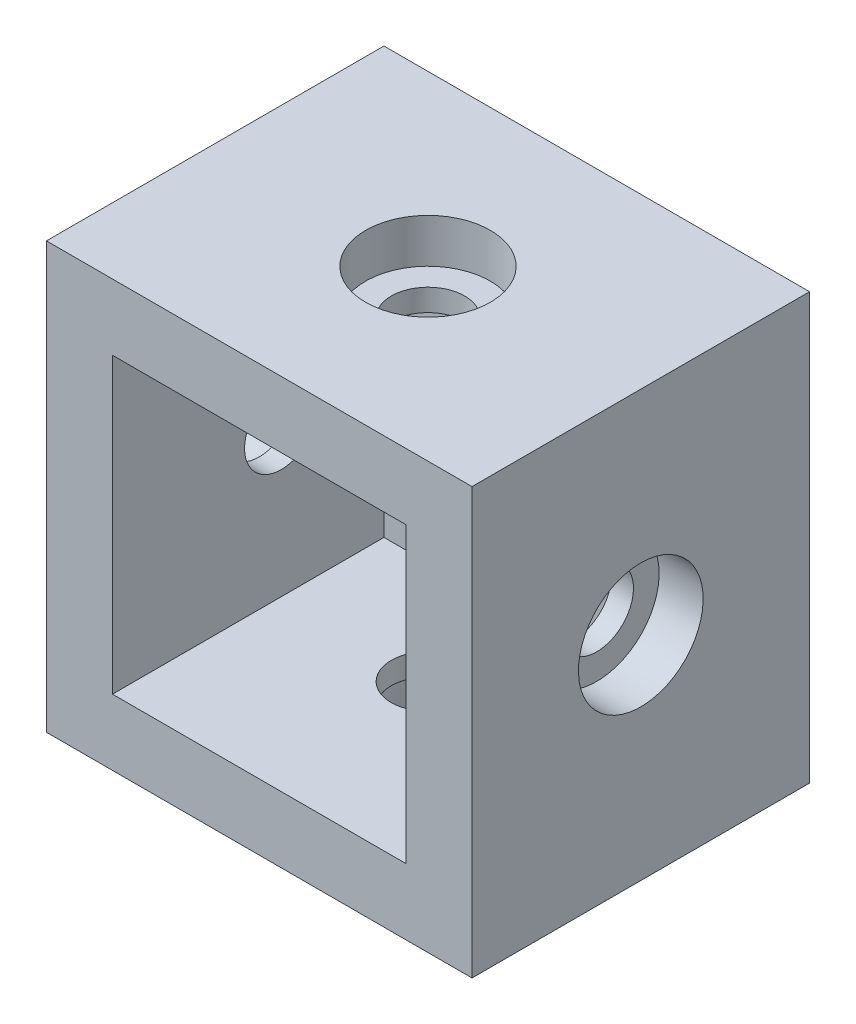
ISO-10303-21;
HEADER;
FILE_DESCRIPTION(('STEP AP214'),'2;1');
FILE_NAME('part.step','',(''),(''),'','','');
FILE_SCHEMA(('AUTOMOTIVE_DESIGN { 1 0 10303 214 1 1 1 1 }'));
ENDSEC;
DATA;
#1=APPLICATION_CONTEXT('core data for automotive mechanical design processes');
#2=APPLICATION_PROTOCOL_DEFINITION('international standard','automotive_design',2000,#1);
#3=PRODUCT_CONTEXT('',#1,'mechanical');
#4=PRODUCT('Part','Part','',(#3));
#5=PRODUCT_RELATED_PRODUCT_CATEGORY('part','',(#4));
#6=PRODUCT_DEFINITION_FORMATION('','',#4);
#7=PRODUCT_DEFINITION_CONTEXT('part definition',#1,'design');
#8=PRODUCT_DEFINITION('design','',#6,#7);
#9=PRODUCT_DEFINITION_SHAPE('','',#8);
#10=(LENGTH_UNIT() NAMED_UNIT(*) SI_UNIT(.MILLI.,.METRE.));
#11=(NAMED_UNIT(*) PLANE_ANGLE_UNIT() SI_UNIT($,.RADIAN.));
#12=(NAMED_UNIT(*) SI_UNIT($,.STERADIAN.) SOLID_ANGLE_UNIT());
#13=UNCERTAINTY_MEASURE_WITH_UNIT(LENGTH_MEASURE(1.E-05),#10,'distance_accuracy_value','');
#14=(GEOMETRIC_REPRESENTATION_CONTEXT(3) GLOBAL_UNCERTAINTY_ASSIGNED_CONTEXT((#13)) GLOBAL_UNIT_ASSIGNED_CONTEXT((#10,
#11,#12)) REPRESENTATION_CONTEXT('',''));
#15=CARTESIAN_POINT('',(0.,0.,0.));
#16=DIRECTION('',(0.,0.,1.));
#17=DIRECTION('',(1.,0.,0.));
#18=AXIS2_PLACEMENT_3D('',#15,#16,#17);
#19=CARTESIAN_POINT('',(-11.6376722482942,12.0163613072181,23.));
#20=DIRECTION('',(1.,0.,0.));
#21=DIRECTION('',(0.,1.,0.));
#22=AXIS2_PLACEMENT_3D('',#19,#20,#21);
#23=PLANE('',#22);
#24=CARTESIAN_POINT('',(-11.6376722482942,-2.48363869278192,11.5));
#25=DIRECTION('',(-1.,0.,0.));
#26=DIRECTION('',(0.,-1.,0.));
#27=AXIS2_PLACEMENT_3D('',#24,#25,#26);
#28=CIRCLE('',#27,4.25);
#29=CARTESIAN_POINT('',(-11.6376722482942,-6.73363869278192,11.5));
#30=VERTEX_POINT('',#29);
#31=EDGE_CURVE('E192',#30,#30,#28,.T.);
#32=ORIENTED_EDGE('',*,*,#31,.F.);
#33=EDGE_LOOP('',(#32));
#34=FACE_BOUND('',#33,.T.);
#35=DIRECTION('',(0.,-1.,0.));
#36=VECTOR('',#35,1.);
#37=CARTESIAN_POINT('',(-11.6376722482942,12.0163613072181,0.));
#38=LINE('',#37,#36);
#39=CARTESIAN_POINT('',(-11.6376722482942,12.0163613072181,0.));
#40=VERTEX_POINT('',#39);
#41=CARTESIAN_POINT('',(-11.6376722482942,-16.9836386927819,0.));
#42=VERTEX_POINT('',#41);
#43=EDGE_CURVE('E155',#40,#42,#38,.T.);
#44=ORIENTED_EDGE('',*,*,#43,.T.);
#45=DIRECTION('',(0.,0.,-1.));
#46=VECTOR('',#45,1.);
#47=CARTESIAN_POINT('',(-11.6376722482942,-16.9836386927819,23.));
#48=LINE('',#47,#46);
#49=CARTESIAN_POINT('',(-11.6376722482942,-16.9836386927819,23.));
#50=VERTEX_POINT('',#49);
#51=EDGE_CURVE('E11',#50,#42,#48,.T.);
#52=ORIENTED_EDGE('',*,*,#51,.F.);
#53=DIRECTION('',(0.,-1.,0.));
#54=VECTOR('',#53,1.);
#55=CARTESIAN_POINT('',(-11.6376722482942,12.0163613072181,23.));
#56=LINE('',#55,#54);
#57=CARTESIAN_POINT('',(-11.6376722482942,12.0163613072181,23.));
#58=VERTEX_POINT('',#57);
#59=EDGE_CURVE('E148',#58,#50,#56,.T.);
#60=ORIENTED_EDGE('',*,*,#59,.F.);
#61=DIRECTION('',(0.,0.,-1.));
#62=VECTOR('',#61,1.);
#63=CARTESIAN_POINT('',(-11.6376722482942,12.0163613072181,23.));
#64=LINE('',#63,#62);
#65=EDGE_CURVE('E154',#58,#40,#64,.T.);
#66=ORIENTED_EDGE('',*,*,#65,.T.);
#67=EDGE_LOOP('',(#44,#52,#60,#66));
#68=FACE_BOUND('',#67,.T.);
#69=ADVANCED_FACE('F39',(#34,#68),#23,.F.);
#70=CARTESIAN_POINT('',(-11.6376722482942,-16.9836386927819,23.));
#71=DIRECTION('',(0.,1.,0.));
#72=DIRECTION('',(0.,0.,1.));
#73=AXIS2_PLACEMENT_3D('',#70,#71,#72);
#74=PLANE('',#73);
#75=CARTESIAN_POINT('',(2.86232775170583,-16.9836386927819,11.5));
#76=DIRECTION('',(0.,-1.,0.));
#77=DIRECTION('',(0.,0.,-1.));
#78=AXIS2_PLACEMENT_3D('',#75,#76,#77);
#79=CIRCLE('',#78,4.25);
#80=CARTESIAN_POINT('',(2.86232775170583,-16.9836386927819,7.25));
#81=VERTEX_POINT('',#80);
#82=EDGE_CURVE('E208',#81,#81,#79,.T.);
#83=ORIENTED_EDGE('',*,*,#82,.F.);
#84=EDGE_LOOP('',(#83));
#85=FACE_BOUND('',#84,.T.);
#86=DIRECTION('',(1.,0.,0.));
#87=VECTOR('',#86,1.);
#88=CARTESIAN_POINT('',(-11.6376722482942,-16.9836386927819,0.));
#89=LINE('',#88,#87);
#90=CARTESIAN_POINT('',(17.3623277517058,-16.9836386927819,0.));
#91=VERTEX_POINT('',#90);
#92=EDGE_CURVE('E158',#42,#91,#89,.T.);
#93=ORIENTED_EDGE('',*,*,#92,.T.);
#94=DIRECTION('',(0.,0.,-1.));
#95=VECTOR('',#94,1.);
#96=CARTESIAN_POINT('',(17.3623277517058,-16.9836386927819,23.));
#97=LINE('',#96,#95);
#98=CARTESIAN_POINT('',(17.3623277517058,-16.9836386927819,23.));
#99=VERTEX_POINT('',#98);
#100=EDGE_CURVE('E47',#99,#91,#97,.T.);
#101=ORIENTED_EDGE('',*,*,#100,.F.);
#102=DIRECTION('',(1.,0.,0.));
#103=VECTOR('',#102,1.);
#104=CARTESIAN_POINT('',(-11.6376722482942,-16.9836386927819,23.));
#105=LINE('',#104,#103);
#106=EDGE_CURVE('E92',#50,#99,#105,.T.);
#107=ORIENTED_EDGE('',*,*,#106,.F.);
#108=ORIENTED_EDGE('',*,*,#51,.T.);
#109=EDGE_LOOP('',(#93,#101,#107,#108));
#110=FACE_BOUND('',#109,.T.);
#111=ADVANCED_FACE('F235',(#85,#110),#74,.F.);
#112=CARTESIAN_POINT('',(17.3623277517058,12.0163613072181,23.));
#113=DIRECTION('',(-1.,0.,0.));
#114=DIRECTION('',(0.,0.,1.));
#115=AXIS2_PLACEMENT_3D('',#112,#113,#114);
#116=PLANE('',#115);
#117=CARTESIAN_POINT('',(17.3623277517058,-2.48363869278192,11.5));
#118=DIRECTION('',(1.,0.,0.));
#119=DIRECTION('',(0.,1.,0.));
#120=AXIS2_PLACEMENT_3D('',#117,#118,#119);
#121=CIRCLE('',#120,4.25);
#122=CARTESIAN_POINT('',(17.3623277517058,1.76636130721808,11.5));
#123=VERTEX_POINT('',#122);
#124=EDGE_CURVE('E202',#123,#123,#121,.T.);
#125=ORIENTED_EDGE('',*,*,#124,.F.);
#126=EDGE_LOOP('',(#125));
#127=FACE_BOUND('',#126,.T.);
#128=DIRECTION('',(0.,1.,0.));
#129=VECTOR('',#128,1.);
#130=CARTESIAN_POINT('',(17.3623277517058,12.0163613072181,0.));
#131=LINE('',#130,#129);
#132=CARTESIAN_POINT('',(17.3623277517058,12.0163613072181,0.));
#133=VERTEX_POINT('',#132);
#134=EDGE_CURVE('E160',#91,#133,#131,.T.);
#135=ORIENTED_EDGE('',*,*,#134,.T.);
#136=DIRECTION('',(0.,0.,-1.));
#137=VECTOR('',#136,1.);
#138=CARTESIAN_POINT('',(17.3623277517058,12.0163613072181,23.));
#139=LINE('',#138,#137);
#140=CARTESIAN_POINT('',(17.3623277517058,12.0163613072181,23.));
#141=VERTEX_POINT('',#140);
#142=EDGE_CURVE('E164',#141,#133,#139,.T.);
#143=ORIENTED_EDGE('',*,*,#142,.F.);
#144=DIRECTION('',(0.,1.,0.));
#145=VECTOR('',#144,1.);
#146=CARTESIAN_POINT('',(17.3623277517058,12.0163613072181,23.));
#147=LINE('',#146,#145);
#148=EDGE_CURVE('E151',#99,#141,#147,.T.);
#149=ORIENTED_EDGE('',*,*,#148,.F.);
#150=ORIENTED_EDGE('',*,*,#100,.T.);
#151=EDGE_LOOP('',(#135,#143,#149,#150));
#152=FACE_BOUND('',#151,.T.);
#153=ADVANCED_FACE('F240',(#127,#152),#116,.F.);
#154=CARTESIAN_POINT('',(-11.6376722482942,12.0163613072181,23.));
#155=DIRECTION('',(0.,-1.,0.));
#156=DIRECTION('',(0.,0.,-1.));
#157=AXIS2_PLACEMENT_3D('',#154,#155,#156);
#158=PLANE('',#157);
#159=CARTESIAN_POINT('',(2.86232775170583,12.0163613072181,11.5));
#160=DIRECTION('',(0.,1.,0.));
#161=DIRECTION('',(0.,0.,1.));
#162=AXIS2_PLACEMENT_3D('',#159,#160,#161);
#163=CIRCLE('',#162,4.25);
#164=CARTESIAN_POINT('',(2.86232775170583,12.0163613072181,15.75));
#165=VERTEX_POINT('',#164);
#166=EDGE_CURVE('E196',#165,#165,#163,.T.);
#167=ORIENTED_EDGE('',*,*,#166,.F.);
#168=EDGE_LOOP('',(#167));
#169=FACE_BOUND('',#168,.T.);
#170=DIRECTION('',(-1.,0.,0.));
#171=VECTOR('',#170,1.);
#172=CARTESIAN_POINT('',(-11.6376722482942,12.0163613072181,0.));
#173=LINE('',#172,#171);
#174=EDGE_CURVE('E85',#133,#40,#173,.T.);
#175=ORIENTED_EDGE('',*,*,#174,.T.);
#176=ORIENTED_EDGE('',*,*,#65,.F.);
#177=DIRECTION('',(-1.,0.,0.));
#178=VECTOR('',#177,1.);
#179=CARTESIAN_POINT('',(-11.6376722482942,12.0163613072181,23.));
#180=LINE('',#179,#178);
#181=EDGE_CURVE('E64',#141,#58,#180,.T.);
#182=ORIENTED_EDGE('',*,*,#181,.F.);
#183=ORIENTED_EDGE('',*,*,#142,.T.);
#184=EDGE_LOOP('',(#175,#176,#182,#183));
#185=FACE_BOUND('',#184,.T.);
#186=ADVANCED_FACE('F229',(#169,#185),#158,.F.);
#187=CARTESIAN_POINT('',(0.,0.,23.));
#188=DIRECTION('',(0.,0.,1.));
#189=DIRECTION('',(1.,0.,0.));
#190=AXIS2_PLACEMENT_3D('',#187,#188,#189);
#191=PLANE('',#190);
#192=DIRECTION('',(0.,-1.,0.));
#193=VECTOR('',#192,1.);
#194=CARTESIAN_POINT('',(-7.13767224829418,12.0163613072181,23.));
#195=LINE('',#194,#193);
#196=CARTESIAN_POINT('',(-7.13767224829418,7.51636130721808,23.));
#197=VERTEX_POINT('',#196);
#198=CARTESIAN_POINT('',(-7.13767224829417,-12.4836386927819,23.));
#199=VERTEX_POINT('',#198);
#200=EDGE_CURVE('E137',#197,#199,#195,.T.);
#201=ORIENTED_EDGE('',*,*,#200,.F.);
#202=DIRECTION('',(-1.,0.,0.));
#203=VECTOR('',#202,1.);
#204=CARTESIAN_POINT('',(-11.6376722482942,7.51636130721808,23.));
#205=LINE('',#204,#203);
#206=CARTESIAN_POINT('',(12.8623277517058,7.51636130721808,23.));
#207=VERTEX_POINT('',#206);
#208=EDGE_CURVE('E146',#207,#197,#205,.T.);
#209=ORIENTED_EDGE('',*,*,#208,.F.);
#210=DIRECTION('',(0.,1.,0.));
#211=VECTOR('',#210,1.);
#212=CARTESIAN_POINT('',(12.8623277517058,12.0163613072181,23.));
#213=LINE('',#212,#211);
#214=CARTESIAN_POINT('',(12.8623277517058,-12.4836386927819,23.));
#215=VERTEX_POINT('',#214);
#216=EDGE_CURVE('E144',#215,#207,#213,.T.);
#217=ORIENTED_EDGE('',*,*,#216,.F.);
#218=DIRECTION('',(1.,0.,0.));
#219=VECTOR('',#218,1.);
#220=CARTESIAN_POINT('',(-11.6376722482942,-12.4836386927819,23.));
#221=LINE('',#220,#219);
#222=EDGE_CURVE('E129',#199,#215,#221,.T.);
#223=ORIENTED_EDGE('',*,*,#222,.F.);
#224=EDGE_LOOP('',(#201,#209,#217,#223));
#225=FACE_BOUND('',#224,.T.);
#226=ORIENTED_EDGE('',*,*,#59,.T.);
#227=ORIENTED_EDGE('',*,*,#106,.T.);
#228=ORIENTED_EDGE('',*,*,#148,.T.);
#229=ORIENTED_EDGE('',*,*,#181,.T.);
#230=EDGE_LOOP('',(#226,#227,#228,#229));
#231=FACE_BOUND('',#230,.T.);
#232=ADVANCED_FACE('F226',(#225,#231),#191,.T.);
#233=CARTESIAN_POINT('',(0.,0.,0.));
#234=DIRECTION('',(0.,0.,1.));
#235=DIRECTION('',(1.,0.,0.));
#236=AXIS2_PLACEMENT_3D('',#233,#234,#235);
#237=PLANE('',#236);
#238=ORIENTED_EDGE('',*,*,#43,.F.);
#239=ORIENTED_EDGE('',*,*,#174,.F.);
#240=ORIENTED_EDGE('',*,*,#134,.F.);
#241=ORIENTED_EDGE('',*,*,#92,.F.);
#242=EDGE_LOOP('',(#238,#239,#240,#241));
#243=FACE_BOUND('',#242,.T.);
#244=ADVANCED_FACE('F228',(#243),#237,.F.);
#245=CARTESIAN_POINT('',(-7.13767224829418,12.0163613072181,23.));
#246=DIRECTION('',(1.,0.,0.));
#247=DIRECTION('',(0.,1.,0.));
#248=AXIS2_PLACEMENT_3D('',#245,#246,#247);
#249=PLANE('',#248);
#250=CARTESIAN_POINT('',(-7.13767224829418,-2.48363869278192,11.5));
#251=DIRECTION('',(1.,0.,0.));
#252=DIRECTION('',(0.,1.,0.));
#253=AXIS2_PLACEMENT_3D('',#250,#251,#252);
#254=CIRCLE('',#253,2.5);
#255=CARTESIAN_POINT('',(-7.13767224829418,0.016361307218079,11.5));
#256=VERTEX_POINT('',#255);
#257=EDGE_CURVE('E42',#256,#256,#254,.T.);
#258=ORIENTED_EDGE('',*,*,#257,.F.);
#259=EDGE_LOOP('',(#258));
#260=FACE_BOUND('',#259,.T.);
#261=DIRECTION('',(0.,-1.,0.));
#262=VECTOR('',#261,1.);
#263=CARTESIAN_POINT('',(-7.13767224829418,12.0163613072181,4.5));
#264=LINE('',#263,#262);
#265=CARTESIAN_POINT('',(-7.13767224829418,7.51636130721808,4.5));
#266=VERTEX_POINT('',#265);
#267=CARTESIAN_POINT('',(-7.13767224829417,-12.4836386927819,4.5));
#268=VERTEX_POINT('',#267);
#269=EDGE_CURVE('E120',#266,#268,#264,.T.);
#270=ORIENTED_EDGE('',*,*,#269,.F.);
#271=DIRECTION('',(0.,0.,-1.));
#272=VECTOR('',#271,1.);
#273=CARTESIAN_POINT('',(-7.13767224829418,7.51636130721808,23.));
#274=LINE('',#273,#272);
#275=EDGE_CURVE('E140',#197,#266,#274,.T.);
#276=ORIENTED_EDGE('',*,*,#275,.F.);
#277=ORIENTED_EDGE('',*,*,#200,.T.);
#278=DIRECTION('',(0.,0.,-1.));
#279=VECTOR('',#278,1.);
#280=CARTESIAN_POINT('',(-7.13767224829417,-12.4836386927819,23.));
#281=LINE('',#280,#279);
#282=EDGE_CURVE('E132',#199,#268,#281,.T.);
#283=ORIENTED_EDGE('',*,*,#282,.T.);
#284=EDGE_LOOP('',(#270,#276,#277,#283));
#285=FACE_BOUND('',#284,.T.);
#286=ADVANCED_FACE('F224',(#260,#285),#249,.T.);
#287=CARTESIAN_POINT('',(-11.6376722482942,-12.4836386927819,23.));
#288=DIRECTION('',(0.,1.,0.));
#289=DIRECTION('',(0.,0.,1.));
#290=AXIS2_PLACEMENT_3D('',#287,#288,#289);
#291=PLANE('',#290);
#292=CARTESIAN_POINT('',(2.86232775170583,-12.4836386927819,11.5));
#293=DIRECTION('',(0.,1.,0.));
#294=DIRECTION('',(0.,0.,1.));
#295=AXIS2_PLACEMENT_3D('',#292,#293,#294);
#296=CIRCLE('',#295,2.5);
#297=CARTESIAN_POINT('',(2.86232775170583,-12.4836386927819,14.));
#298=VERTEX_POINT('',#297);
#299=EDGE_CURVE('E189',#298,#298,#296,.T.);
#300=ORIENTED_EDGE('',*,*,#299,.F.);
#301=EDGE_LOOP('',(#300));
#302=FACE_BOUND('',#301,.T.);
#303=DIRECTION('',(1.,0.,0.));
#304=VECTOR('',#303,1.);
#305=CARTESIAN_POINT('',(-11.6376722482942,-12.4836386927819,4.5));
#306=LINE('',#305,#304);
#307=CARTESIAN_POINT('',(12.8623277517058,-12.4836386927819,4.5));
#308=VERTEX_POINT('',#307);
#309=EDGE_CURVE('E114',#268,#308,#306,.T.);
#310=ORIENTED_EDGE('',*,*,#309,.F.);
#311=ORIENTED_EDGE('',*,*,#282,.F.);
#312=ORIENTED_EDGE('',*,*,#222,.T.);
#313=DIRECTION('',(0.,0.,-1.));
#314=VECTOR('',#313,1.);
#315=CARTESIAN_POINT('',(12.8623277517058,-12.4836386927819,23.));
#316=LINE('',#315,#314);
#317=EDGE_CURVE('E126',#215,#308,#316,.T.);
#318=ORIENTED_EDGE('',*,*,#317,.T.);
#319=EDGE_LOOP('',(#310,#311,#312,#318));
#320=FACE_BOUND('',#319,.T.);
#321=ADVANCED_FACE('F127',(#302,#320),#291,.T.);
#322=CARTESIAN_POINT('',(12.8623277517058,12.0163613072181,23.));
#323=DIRECTION('',(-1.,0.,0.));
#324=DIRECTION('',(0.,0.,1.));
#325=AXIS2_PLACEMENT_3D('',#322,#323,#324);
#326=PLANE('',#325);
#327=CARTESIAN_POINT('',(12.8623277517058,-2.48363869278192,11.5));
#328=DIRECTION('',(-1.,0.,0.));
#329=DIRECTION('',(0.,0.,1.));
#330=AXIS2_PLACEMENT_3D('',#327,#328,#329);
#331=CIRCLE('',#330,2.5);
#332=CARTESIAN_POINT('',(12.8623277517058,-2.48363869278192,14.));
#333=VERTEX_POINT('',#332);
#334=EDGE_CURVE('E172',#333,#333,#331,.T.);
#335=ORIENTED_EDGE('',*,*,#334,.F.);
#336=EDGE_LOOP('',(#335));
#337=FACE_BOUND('',#336,.T.);
#338=DIRECTION('',(0.,1.,0.));
#339=VECTOR('',#338,1.);
#340=CARTESIAN_POINT('',(12.8623277517058,12.0163613072181,4.5));
#341=LINE('',#340,#339);
#342=CARTESIAN_POINT('',(12.8623277517058,7.51636130721808,4.5));
#343=VERTEX_POINT('',#342);
#344=EDGE_CURVE('E118',#308,#343,#341,.T.);
#345=ORIENTED_EDGE('',*,*,#344,.F.);
#346=ORIENTED_EDGE('',*,*,#317,.F.);
#347=ORIENTED_EDGE('',*,*,#216,.T.);
#348=DIRECTION('',(0.,0.,-1.));
#349=VECTOR('',#348,1.);
#350=CARTESIAN_POINT('',(12.8623277517058,7.51636130721808,23.));
#351=LINE('',#350,#349);
#352=EDGE_CURVE('E55',#207,#343,#351,.T.);
#353=ORIENTED_EDGE('',*,*,#352,.T.);
#354=EDGE_LOOP('',(#345,#346,#347,#353));
#355=FACE_BOUND('',#354,.T.);
#356=ADVANCED_FACE('F134',(#337,#355),#326,.T.);
#357=CARTESIAN_POINT('',(-11.6376722482942,7.51636130721808,23.));
#358=DIRECTION('',(0.,-1.,0.));
#359=DIRECTION('',(0.,0.,-1.));
#360=AXIS2_PLACEMENT_3D('',#357,#358,#359);
#361=PLANE('',#360);
#362=CARTESIAN_POINT('',(2.86232775170583,7.51636130721808,11.5));
#363=DIRECTION('',(0.,-1.,0.));
#364=DIRECTION('',(0.,0.,-1.));
#365=AXIS2_PLACEMENT_3D('',#362,#363,#364);
#366=CIRCLE('',#365,2.5);
#367=CARTESIAN_POINT('',(2.86232775170583,7.51636130721808,9.));
#368=VERTEX_POINT('',#367);
#369=EDGE_CURVE('E170',#368,#368,#366,.T.);
#370=ORIENTED_EDGE('',*,*,#369,.F.);
#371=EDGE_LOOP('',(#370));
#372=FACE_BOUND('',#371,.T.);
#373=DIRECTION('',(-1.,0.,0.));
#374=VECTOR('',#373,1.);
#375=CARTESIAN_POINT('',(-11.6376722482942,7.51636130721808,4.5));
#376=LINE('',#375,#374);
#377=EDGE_CURVE('E135',#343,#266,#376,.T.);
#378=ORIENTED_EDGE('',*,*,#377,.F.);
#379=ORIENTED_EDGE('',*,*,#352,.F.);
#380=ORIENTED_EDGE('',*,*,#208,.T.);
#381=ORIENTED_EDGE('',*,*,#275,.T.);
#382=EDGE_LOOP('',(#378,#379,#380,#381));
#383=FACE_BOUND('',#382,.T.);
#384=ADVANCED_FACE('F220',(#372,#383),#361,.T.);
#385=CARTESIAN_POINT('',(0.,0.,4.5));
#386=DIRECTION('',(0.,0.,1.));
#387=DIRECTION('',(1.,0.,0.));
#388=AXIS2_PLACEMENT_3D('',#385,#386,#387);
#389=PLANE('',#388);
#390=ORIENTED_EDGE('',*,*,#269,.T.);
#391=ORIENTED_EDGE('',*,*,#309,.T.);
#392=ORIENTED_EDGE('',*,*,#344,.T.);
#393=ORIENTED_EDGE('',*,*,#377,.T.);
#394=EDGE_LOOP('',(#390,#391,#392,#393));
#395=FACE_BOUND('',#394,.T.);
#396=ADVANCED_FACE('F116',(#395),#389,.T.);
#397=CARTESIAN_POINT('',(2.86232775170583,-13.9836386927819,11.5));
#398=DIRECTION('',(0.,-1.,0.));
#399=DIRECTION('',(0.,0.,-1.));
#400=AXIS2_PLACEMENT_3D('',#397,#398,#399);
#401=CYLINDRICAL_SURFACE('',#400,4.25);
#402=CARTESIAN_POINT('',(2.86232775170583,-13.9836386927819,11.5));
#403=DIRECTION('',(0.,-1.,0.));
#404=DIRECTION('',(0.,0.,-1.));
#405=AXIS2_PLACEMENT_3D('',#402,#403,#404);
#406=CIRCLE('',#405,4.25);
#407=CARTESIAN_POINT('',(2.86232775170583,-13.9836386927819,7.25));
#408=VERTEX_POINT('',#407);
#409=EDGE_CURVE('E211',#408,#408,#406,.T.);
#410=ORIENTED_EDGE('',*,*,#409,.F.);
#411=EDGE_LOOP('',(#410));
#412=FACE_BOUND('',#411,.T.);
#413=ORIENTED_EDGE('',*,*,#82,.T.);
#414=EDGE_LOOP('',(#413));
#415=FACE_BOUND('',#414,.T.);
#416=ADVANCED_FACE('F291',(#412,#415),#401,.F.);
#417=CARTESIAN_POINT('',(2.86232775170583,-13.9836386927819,11.5));
#418=DIRECTION('',(0.,-1.,0.));
#419=DIRECTION('',(0.,0.,-1.));
#420=AXIS2_PLACEMENT_3D('',#417,#418,#419);
#421=PLANE('',#420);
#422=CARTESIAN_POINT('',(2.86232775170583,-13.9836386927819,11.5));
#423=DIRECTION('',(0.,-1.,0.));
#424=DIRECTION('',(0.,0.,-1.));
#425=AXIS2_PLACEMENT_3D('',#422,#423,#424);
#426=CIRCLE('',#425,2.5);
#427=CARTESIAN_POINT('',(2.86232775170583,-13.9836386927819,9.));
#428=VERTEX_POINT('',#427);
#429=EDGE_CURVE('E168',#428,#428,#426,.T.);
#430=ORIENTED_EDGE('',*,*,#429,.F.);
#431=EDGE_LOOP('',(#430));
#432=FACE_BOUND('',#431,.T.);
#433=ORIENTED_EDGE('',*,*,#409,.T.);
#434=EDGE_LOOP('',(#433));
#435=FACE_BOUND('',#434,.T.);
#436=ADVANCED_FACE('F287',(#432,#435),#421,.T.);
#437=CARTESIAN_POINT('',(14.3623277517058,-2.48363869278192,11.5));
#438=DIRECTION('',(1.,0.,0.));
#439=DIRECTION('',(0.,1.,0.));
#440=AXIS2_PLACEMENT_3D('',#437,#438,#439);
#441=CYLINDRICAL_SURFACE('',#440,4.25);
#442=CARTESIAN_POINT('',(14.3623277517058,-2.48363869278192,11.5));
#443=DIRECTION('',(1.,0.,0.));
#444=DIRECTION('',(0.,1.,0.));
#445=AXIS2_PLACEMENT_3D('',#442,#443,#444);
#446=CIRCLE('',#445,4.25);
#447=CARTESIAN_POINT('',(14.3623277517058,1.76636130721808,11.5));
#448=VERTEX_POINT('',#447);
#449=EDGE_CURVE('E205',#448,#448,#446,.T.);
#450=ORIENTED_EDGE('',*,*,#449,.F.);
#451=EDGE_LOOP('',(#450));
#452=FACE_BOUND('',#451,.T.);
#453=ORIENTED_EDGE('',*,*,#124,.T.);
#454=EDGE_LOOP('',(#453));
#455=FACE_BOUND('',#454,.T.);
#456=ADVANCED_FACE('F283',(#452,#455),#441,.F.);
#457=CARTESIAN_POINT('',(14.3623277517058,-2.48363869278192,11.5));
#458=DIRECTION('',(1.,0.,0.));
#459=DIRECTION('',(0.,1.,0.));
#460=AXIS2_PLACEMENT_3D('',#457,#458,#459);
#461=PLANE('',#460);
#462=CARTESIAN_POINT('',(14.3623277517058,-2.48363869278192,11.5));
#463=DIRECTION('',(1.,0.,0.));
#464=DIRECTION('',(0.,1.,0.));
#465=AXIS2_PLACEMENT_3D('',#462,#463,#464);
#466=CIRCLE('',#465,2.5);
#467=CARTESIAN_POINT('',(14.3623277517058,0.0163613072180807,11.5));
#468=VERTEX_POINT('',#467);
#469=EDGE_CURVE('E174',#468,#468,#466,.T.);
#470=ORIENTED_EDGE('',*,*,#469,.F.);
#471=EDGE_LOOP('',(#470));
#472=FACE_BOUND('',#471,.T.);
#473=ORIENTED_EDGE('',*,*,#449,.T.);
#474=EDGE_LOOP('',(#473));
#475=FACE_BOUND('',#474,.T.);
#476=ADVANCED_FACE('F279',(#472,#475),#461,.T.);
#477=CARTESIAN_POINT('',(2.86232775170583,9.01636130721808,11.5));
#478=DIRECTION('',(0.,1.,0.));
#479=DIRECTION('',(0.,0.,1.));
#480=AXIS2_PLACEMENT_3D('',#477,#478,#479);
#481=CYLINDRICAL_SURFACE('',#480,4.25);
#482=CARTESIAN_POINT('',(2.86232775170583,9.01636130721808,11.5));
#483=DIRECTION('',(0.,1.,0.));
#484=DIRECTION('',(0.,0.,1.));
#485=AXIS2_PLACEMENT_3D('',#482,#483,#484);
#486=CIRCLE('',#485,4.25);
#487=CARTESIAN_POINT('',(2.86232775170583,9.01636130721808,15.75));
#488=VERTEX_POINT('',#487);
#489=EDGE_CURVE('E199',#488,#488,#486,.T.);
#490=ORIENTED_EDGE('',*,*,#489,.F.);
#491=EDGE_LOOP('',(#490));
#492=FACE_BOUND('',#491,.T.);
#493=ORIENTED_EDGE('',*,*,#166,.T.);
#494=EDGE_LOOP('',(#493));
#495=FACE_BOUND('',#494,.T.);
#496=ADVANCED_FACE('F271',(#492,#495),#481,.F.);
#497=CARTESIAN_POINT('',(2.86232775170583,9.01636130721808,11.5));
#498=DIRECTION('',(0.,1.,0.));
#499=DIRECTION('',(0.,0.,1.));
#500=AXIS2_PLACEMENT_3D('',#497,#498,#499);
#501=PLANE('',#500);
#502=CARTESIAN_POINT('',(2.86232775170583,9.01636130721808,11.5));
#503=DIRECTION('',(0.,1.,0.));
#504=DIRECTION('',(0.,0.,1.));
#505=AXIS2_PLACEMENT_3D('',#502,#503,#504);
#506=CIRCLE('',#505,2.5);
#507=CARTESIAN_POINT('',(2.86232775170583,9.01636130721808,14.));
#508=VERTEX_POINT('',#507);
#509=EDGE_CURVE('E171',#508,#508,#506,.T.);
#510=ORIENTED_EDGE('',*,*,#509,.F.);
#511=EDGE_LOOP('',(#510));
#512=FACE_BOUND('',#511,.T.);
#513=ORIENTED_EDGE('',*,*,#489,.T.);
#514=EDGE_LOOP('',(#513));
#515=FACE_BOUND('',#514,.T.);
#516=ADVANCED_FACE('F261',(#512,#515),#501,.T.);
#517=CARTESIAN_POINT('',(-8.63767224829418,-2.48363869278192,11.5));
#518=DIRECTION('',(-1.,0.,0.));
#519=DIRECTION('',(0.,-1.,0.));
#520=AXIS2_PLACEMENT_3D('',#517,#518,#519);
#521=CYLINDRICAL_SURFACE('',#520,4.25);
#522=CARTESIAN_POINT('',(-8.63767224829418,-2.48363869278192,11.5));
#523=DIRECTION('',(-1.,0.,0.));
#524=DIRECTION('',(0.,-1.,0.));
#525=AXIS2_PLACEMENT_3D('',#522,#523,#524);
#526=CIRCLE('',#525,4.25);
#527=CARTESIAN_POINT('',(-8.63767224829418,-6.73363869278192,11.5));
#528=VERTEX_POINT('',#527);
#529=EDGE_CURVE('E193',#528,#528,#526,.T.);
#530=ORIENTED_EDGE('',*,*,#529,.F.);
#531=EDGE_LOOP('',(#530));
#532=FACE_BOUND('',#531,.T.);
#533=ORIENTED_EDGE('',*,*,#31,.T.);
#534=EDGE_LOOP('',(#533));
#535=FACE_BOUND('',#534,.T.);
#536=ADVANCED_FACE('F258',(#532,#535),#521,.F.);
#537=CARTESIAN_POINT('',(-8.63767224829418,-2.48363869278192,11.5));
#538=DIRECTION('',(-1.,0.,0.));
#539=DIRECTION('',(0.,-1.,0.));
#540=AXIS2_PLACEMENT_3D('',#537,#538,#539);
#541=PLANE('',#540);
#542=CARTESIAN_POINT('',(-8.63767224829418,-2.48363869278192,11.5));
#543=DIRECTION('',(-1.,0.,0.));
#544=DIRECTION('',(0.,-1.,0.));
#545=AXIS2_PLACEMENT_3D('',#542,#543,#544);
#546=CIRCLE('',#545,2.5);
#547=CARTESIAN_POINT('',(-8.63767224829418,-4.98363869278192,11.5));
#548=VERTEX_POINT('',#547);
#549=EDGE_CURVE('E184',#548,#548,#546,.T.);
#550=ORIENTED_EDGE('',*,*,#549,.F.);
#551=EDGE_LOOP('',(#550));
#552=FACE_BOUND('',#551,.T.);
#553=ORIENTED_EDGE('',*,*,#529,.T.);
#554=EDGE_LOOP('',(#553));
#555=FACE_BOUND('',#554,.T.);
#556=ADVANCED_FACE('F260',(#552,#555),#541,.T.);
#557=CARTESIAN_POINT('',(2.86232775170583,-16.9836386927819,11.5));
#558=DIRECTION('',(0.,1.,0.));
#559=DIRECTION('',(0.,0.,1.));
#560=AXIS2_PLACEMENT_3D('',#557,#558,#559);
#561=CYLINDRICAL_SURFACE('',#560,2.5);
#562=ORIENTED_EDGE('',*,*,#299,.T.);
#563=EDGE_LOOP('',(#562));
#564=FACE_BOUND('',#563,.T.);
#565=ORIENTED_EDGE('',*,*,#429,.T.);
#566=EDGE_LOOP('',(#565));
#567=FACE_BOUND('',#566,.T.);
#568=ADVANCED_FACE('F268',(#564,#567),#561,.F.);
#569=ORIENTED_EDGE('',*,*,#369,.T.);
#570=EDGE_LOOP('',(#569));
#571=FACE_BOUND('',#570,.T.);
#572=ORIENTED_EDGE('',*,*,#509,.T.);
#573=EDGE_LOOP('',(#572));
#574=FACE_BOUND('',#573,.T.);
#575=ADVANCED_FACE('F351',(#571,#574),#561,.F.);
#576=CARTESIAN_POINT('',(2.86232775170583,-2.48363869278192,11.5));
#577=DIRECTION('',(1.,0.,0.));
#578=DIRECTION('',(0.,1.,0.));
#579=AXIS2_PLACEMENT_3D('',#576,#577,#578);
#580=CYLINDRICAL_SURFACE('',#579,2.5);
#581=ORIENTED_EDGE('',*,*,#334,.T.);
#582=EDGE_LOOP('',(#581));
#583=FACE_BOUND('',#582,.T.);
#584=ORIENTED_EDGE('',*,*,#469,.T.);
#585=EDGE_LOOP('',(#584));
#586=FACE_BOUND('',#585,.T.);
#587=ADVANCED_FACE('F346',(#583,#586),#580,.F.);
#588=CARTESIAN_POINT('',(2.86232775170582,-2.48363869278192,11.5));
#589=DIRECTION('',(-1.,0.,0.));
#590=DIRECTION('',(0.,-1.,0.));
#591=AXIS2_PLACEMENT_3D('',#588,#589,#590);
#592=CYLINDRICAL_SURFACE('',#591,2.5);
#593=ORIENTED_EDGE('',*,*,#257,.T.);
#594=EDGE_LOOP('',(#593));
#595=FACE_BOUND('',#594,.T.);
#596=ORIENTED_EDGE('',*,*,#549,.T.);
#597=EDGE_LOOP('',(#596));
#598=FACE_BOUND('',#597,.T.);
#599=ADVANCED_FACE('F350',(#595,#598),#592,.F.);
#600=CLOSED_SHELL('',(#69,#111,#153,#186,#232,#244,#286,#321,#356,#384,#396,#416,#436,#456,#476,
#496,#516,#536,#556,#568,#575,#587,#599));
#601=MANIFOLD_SOLID_BREP('B2',#600);
#602=ADVANCED_BREP_SHAPE_REPRESENTATION('',(#18,#601),#14);
#603=SHAPE_DEFINITION_REPRESENTATION(#9,#602);
ENDSEC;
END-ISO-10303-21;
